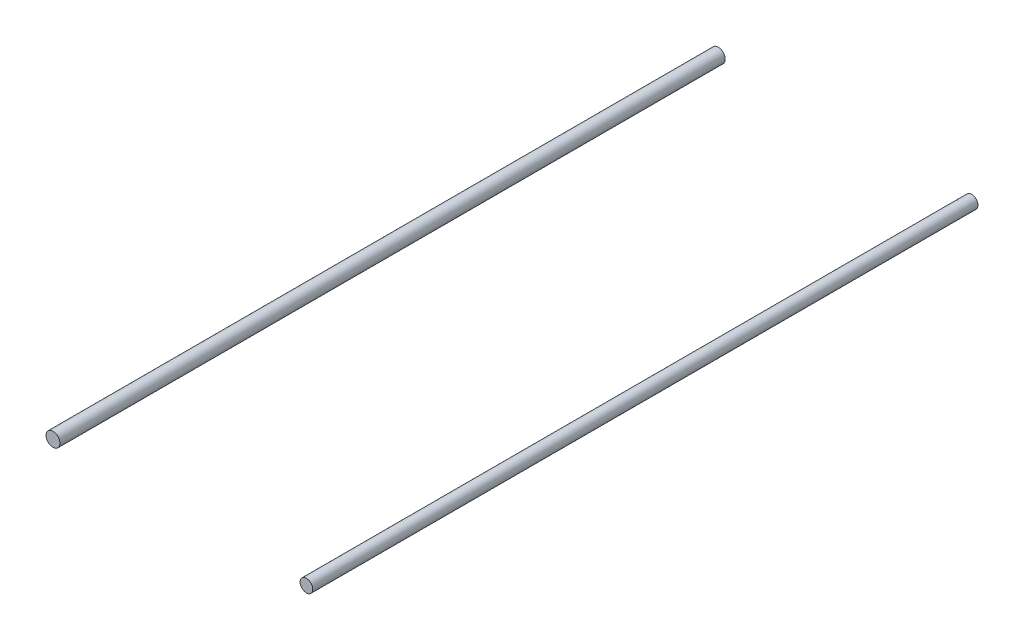
ISO-10303-21;
HEADER;
FILE_DESCRIPTION(('STEP AP214'),'2;1');
FILE_NAME('part.step','',(''),(''),'','','');
FILE_SCHEMA(('AUTOMOTIVE_DESIGN { 1 0 10303 214 1 1 1 1 }'));
ENDSEC;
DATA;
#1=APPLICATION_CONTEXT('core data for automotive mechanical design processes');
#2=APPLICATION_PROTOCOL_DEFINITION('international standard','automotive_design',2000,#1);
#3=PRODUCT_CONTEXT('',#1,'mechanical');
#4=PRODUCT('Part','Part','',(#3));
#5=PRODUCT_RELATED_PRODUCT_CATEGORY('part','',(#4));
#6=PRODUCT_DEFINITION_FORMATION('','',#4);
#7=PRODUCT_DEFINITION_CONTEXT('part definition',#1,'design');
#8=PRODUCT_DEFINITION('design','',#6,#7);
#9=PRODUCT_DEFINITION_SHAPE('','',#8);
#10=(LENGTH_UNIT() NAMED_UNIT(*) SI_UNIT(.MILLI.,.METRE.));
#11=(NAMED_UNIT(*) PLANE_ANGLE_UNIT() SI_UNIT($,.RADIAN.));
#12=(NAMED_UNIT(*) SI_UNIT($,.STERADIAN.) SOLID_ANGLE_UNIT());
#13=UNCERTAINTY_MEASURE_WITH_UNIT(LENGTH_MEASURE(1.E-05),#10,'distance_accuracy_value','');
#14=(GEOMETRIC_REPRESENTATION_CONTEXT(3) GLOBAL_UNCERTAINTY_ASSIGNED_CONTEXT((#13)) GLOBAL_UNIT_ASSIGNED_CONTEXT((#10,
#11,#12)) REPRESENTATION_CONTEXT('',''));
#15=CARTESIAN_POINT('',(0.,0.,0.));
#16=DIRECTION('',(0.,0.,1.));
#17=DIRECTION('',(1.,0.,0.));
#18=AXIS2_PLACEMENT_3D('',#15,#16,#17);
#19=CARTESIAN_POINT('',(182.623479248817,97.3397753954965,765.677889561147));
#20=DIRECTION('',(0.,0.,-1.));
#21=DIRECTION('',(-1.,0.,0.));
#22=AXIS2_PLACEMENT_3D('',#19,#20,#21);
#23=PLANE('',#22);
#24=CARTESIAN_POINT('',(182.623479248817,97.3397753954965,765.677889561147));
#25=DIRECTION('',(0.,0.,-1.));
#26=DIRECTION('',(-1.,0.,0.));
#27=AXIS2_PLACEMENT_3D('',#24,#25,#26);
#28=CIRCLE('',#27,4.00000000000958);
#29=CARTESIAN_POINT('',(178.623479248807,97.3397753954965,765.677889561147));
#30=VERTEX_POINT('',#29);
#31=EDGE_CURVE('P0_E17',#30,#30,#28,.T.);
#32=ORIENTED_EDGE('',*,*,#31,.F.);
#33=EDGE_LOOP('',(#32));
#34=FACE_BOUND('',#33,.T.);
#35=ADVANCED_FACE('P0_F14',(#34),#23,.F.);
#36=CARTESIAN_POINT('',(182.623479248817,97.3397753954965,345.677889561147));
#37=DIRECTION('',(0.,0.,-1.));
#38=DIRECTION('',(-1.,0.,0.));
#39=AXIS2_PLACEMENT_3D('',#36,#37,#38);
#40=PLANE('',#39);
#41=CARTESIAN_POINT('',(182.623479248817,97.3397753954965,345.677889561147));
#42=DIRECTION('',(0.,0.,-1.));
#43=DIRECTION('',(-1.,0.,0.));
#44=AXIS2_PLACEMENT_3D('',#41,#42,#43);
#45=CIRCLE('',#44,4.00000000000958);
#46=CARTESIAN_POINT('',(178.623479248807,97.3397753954965,345.677889561147));
#47=VERTEX_POINT('',#46);
#48=EDGE_CURVE('P0_E10',#47,#47,#45,.F.);
#49=ORIENTED_EDGE('',*,*,#48,.F.);
#50=EDGE_LOOP('',(#49));
#51=FACE_BOUND('',#50,.T.);
#52=ADVANCED_FACE('P0_F29',(#51),#40,.T.);
#53=CARTESIAN_POINT('',(182.623479248817,97.3397753954965,765.677889561147));
#54=DIRECTION('',(0.,0.,-1.));
#55=DIRECTION('',(-1.,0.,0.));
#56=AXIS2_PLACEMENT_3D('',#53,#54,#55);
#57=CYLINDRICAL_SURFACE('',#56,4.00000000000958);
#58=ORIENTED_EDGE('',*,*,#48,.T.);
#59=EDGE_LOOP('',(#58));
#60=FACE_BOUND('',#59,.T.);
#61=ORIENTED_EDGE('',*,*,#31,.T.);
#62=EDGE_LOOP('',(#61));
#63=FACE_BOUND('',#62,.T.);
#64=ADVANCED_FACE('P0_F26',(#60,#63),#57,.T.);
#65=CLOSED_SHELL('',(#35,#52,#64));
#66=MANIFOLD_SOLID_BREP('P0_B1',#65);
#67=CARTESIAN_POINT('',(22.6234792488169,97.3397753954963,765.677889561147));
#68=DIRECTION('',(0.,0.,-1.));
#69=DIRECTION('',(-1.,0.,0.));
#70=AXIS2_PLACEMENT_3D('',#67,#68,#69);
#71=PLANE('',#70);
#72=CARTESIAN_POINT('',(22.6234792488169,97.3397753954963,765.677889561147));
#73=DIRECTION('',(0.,0.,-1.));
#74=DIRECTION('',(-1.,0.,0.));
#75=AXIS2_PLACEMENT_3D('',#72,#73,#74);
#76=CIRCLE('',#75,4.40000000002424);
#77=CARTESIAN_POINT('',(18.2234792487926,97.3397753954963,765.677889561147));
#78=VERTEX_POINT('',#77);
#79=EDGE_CURVE('P1_E17',#78,#78,#76,.T.);
#80=ORIENTED_EDGE('',*,*,#79,.F.);
#81=EDGE_LOOP('',(#80));
#82=FACE_BOUND('',#81,.T.);
#83=ADVANCED_FACE('P1_F14',(#82),#71,.F.);
#84=CARTESIAN_POINT('',(22.6234792488169,97.3397753954963,345.677889561147));
#85=DIRECTION('',(0.,0.,-1.));
#86=DIRECTION('',(-1.,0.,0.));
#87=AXIS2_PLACEMENT_3D('',#84,#85,#86);
#88=PLANE('',#87);
#89=CARTESIAN_POINT('',(22.6234792488169,97.3397753954963,345.677889561147));
#90=DIRECTION('',(0.,0.,-1.));
#91=DIRECTION('',(-1.,0.,0.));
#92=AXIS2_PLACEMENT_3D('',#89,#90,#91);
#93=CIRCLE('',#92,4.40000000002424);
#94=CARTESIAN_POINT('',(18.2234792487926,97.3397753954963,345.677889561147));
#95=VERTEX_POINT('',#94);
#96=EDGE_CURVE('P1_E10',#95,#95,#93,.F.);
#97=ORIENTED_EDGE('',*,*,#96,.F.);
#98=EDGE_LOOP('',(#97));
#99=FACE_BOUND('',#98,.T.);
#100=ADVANCED_FACE('P1_F29',(#99),#88,.T.);
#101=CARTESIAN_POINT('',(22.6234792488169,97.3397753954963,765.677889561147));
#102=DIRECTION('',(0.,0.,-1.));
#103=DIRECTION('',(-1.,0.,0.));
#104=AXIS2_PLACEMENT_3D('',#101,#102,#103);
#105=CYLINDRICAL_SURFACE('',#104,4.40000000002424);
#106=ORIENTED_EDGE('',*,*,#96,.T.);
#107=EDGE_LOOP('',(#106));
#108=FACE_BOUND('',#107,.T.);
#109=ORIENTED_EDGE('',*,*,#79,.T.);
#110=EDGE_LOOP('',(#109));
#111=FACE_BOUND('',#110,.T.);
#112=ADVANCED_FACE('P1_F26',(#108,#111),#105,.T.);
#113=CLOSED_SHELL('',(#83,#100,#112));
#114=MANIFOLD_SOLID_BREP('P1_B1',#113);
#115=ADVANCED_BREP_SHAPE_REPRESENTATION('',(#18,#66,#114),#14);
#116=SHAPE_DEFINITION_REPRESENTATION(#9,#115);
ENDSEC;
END-ISO-10303-21;
